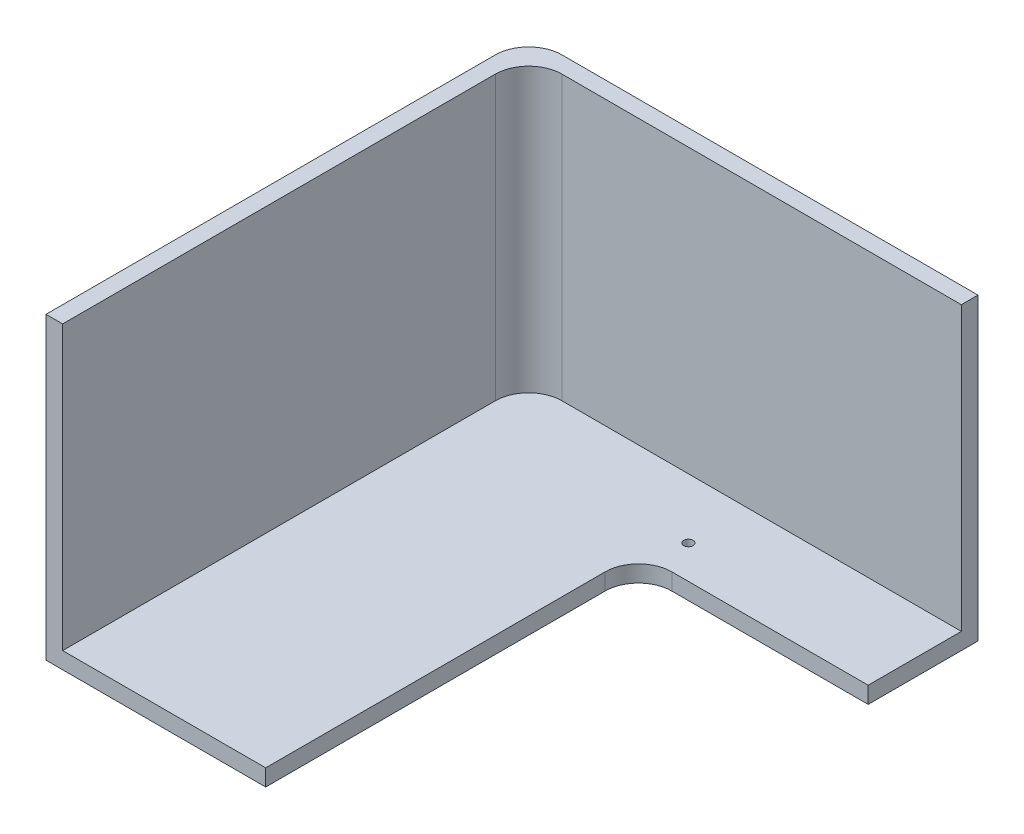
ISO-10303-21;
HEADER;
FILE_DESCRIPTION(('STEP AP214'),'2;1');
FILE_NAME('part.step','',(''),(''),'','','');
FILE_SCHEMA(('AUTOMOTIVE_DESIGN { 1 0 10303 214 1 1 1 1 }'));
ENDSEC;
DATA;
#1=APPLICATION_CONTEXT('core data for automotive mechanical design processes');
#2=APPLICATION_PROTOCOL_DEFINITION('international standard','automotive_design',2000,#1);
#3=PRODUCT_CONTEXT('',#1,'mechanical');
#4=PRODUCT('Part','Part','',(#3));
#5=PRODUCT_RELATED_PRODUCT_CATEGORY('part','',(#4));
#6=PRODUCT_DEFINITION_FORMATION('','',#4);
#7=PRODUCT_DEFINITION_CONTEXT('part definition',#1,'design');
#8=PRODUCT_DEFINITION('design','',#6,#7);
#9=PRODUCT_DEFINITION_SHAPE('','',#8);
#10=(LENGTH_UNIT() NAMED_UNIT(*) SI_UNIT(.MILLI.,.METRE.));
#11=(NAMED_UNIT(*) PLANE_ANGLE_UNIT() SI_UNIT($,.RADIAN.));
#12=(NAMED_UNIT(*) SI_UNIT($,.STERADIAN.) SOLID_ANGLE_UNIT());
#13=UNCERTAINTY_MEASURE_WITH_UNIT(LENGTH_MEASURE(1.E-05),#10,'distance_accuracy_value','');
#14=(GEOMETRIC_REPRESENTATION_CONTEXT(3) GLOBAL_UNCERTAINTY_ASSIGNED_CONTEXT((#13)) GLOBAL_UNIT_ASSIGNED_CONTEXT((#10,
#11,#12)) REPRESENTATION_CONTEXT('',''));
#15=CARTESIAN_POINT('',(0.,0.,0.));
#16=DIRECTION('',(0.,0.,1.));
#17=DIRECTION('',(1.,0.,0.));
#18=AXIS2_PLACEMENT_3D('',#15,#16,#17);
#19=CARTESIAN_POINT('',(0.,90.,0.));
#20=DIRECTION('',(-1.,0.,0.));
#21=DIRECTION('',(0.,0.,1.));
#22=AXIS2_PLACEMENT_3D('',#19,#20,#21);
#23=PLANE('',#22);
#24=DIRECTION('',(0.,0.,-1.));
#25=VECTOR('',#24,1.);
#26=CARTESIAN_POINT('',(0.,5.,5.));
#27=LINE('',#26,#25);
#28=CARTESIAN_POINT('',(0.,5.,33.));
#29=VERTEX_POINT('',#28);
#30=CARTESIAN_POINT('',(0.,5.,5.));
#31=VERTEX_POINT('',#30);
#32=EDGE_CURVE('E170',#29,#31,#27,.T.);
#33=ORIENTED_EDGE('',*,*,#32,.F.);
#34=DIRECTION('',(0.,1.,0.));
#35=VECTOR('',#34,1.);
#36=CARTESIAN_POINT('',(0.,-131.54847015454,33.));
#37=LINE('',#36,#35);
#38=CARTESIAN_POINT('',(0.,0.,33.));
#39=VERTEX_POINT('',#38);
#40=EDGE_CURVE('E163',#39,#29,#37,.T.);
#41=ORIENTED_EDGE('',*,*,#40,.F.);
#42=DIRECTION('',(0.,0.,-1.));
#43=VECTOR('',#42,1.);
#44=CARTESIAN_POINT('',(0.,0.,0.));
#45=LINE('',#44,#43);
#46=CARTESIAN_POINT('',(0.,0.,0.));
#47=VERTEX_POINT('',#46);
#48=EDGE_CURVE('E187',#39,#47,#45,.T.);
#49=ORIENTED_EDGE('',*,*,#48,.T.);
#50=DIRECTION('',(0.,-1.,0.));
#51=VECTOR('',#50,1.);
#52=CARTESIAN_POINT('',(0.,90.,0.));
#53=LINE('',#52,#51);
#54=CARTESIAN_POINT('',(0.,90.,0.));
#55=VERTEX_POINT('',#54);
#56=EDGE_CURVE('E216',#55,#47,#53,.T.);
#57=ORIENTED_EDGE('',*,*,#56,.F.);
#58=DIRECTION('',(0.,0.,-1.));
#59=VECTOR('',#58,1.);
#60=CARTESIAN_POINT('',(0.,90.,0.));
#61=LINE('',#60,#59);
#62=CARTESIAN_POINT('',(0.,90.,5.));
#63=VERTEX_POINT('',#62);
#64=EDGE_CURVE('E188',#63,#55,#61,.T.);
#65=ORIENTED_EDGE('',*,*,#64,.F.);
#66=DIRECTION('',(0.,1.,0.));
#67=VECTOR('',#66,1.);
#68=CARTESIAN_POINT('',(0.,-191.049731745428,5.));
#69=LINE('',#68,#67);
#70=EDGE_CURVE('E176',#31,#63,#69,.T.);
#71=ORIENTED_EDGE('',*,*,#70,.F.);
#72=EDGE_LOOP('',(#33,#41,#49,#57,#65,#71));
#73=FACE_BOUND('',#72,.T.);
#74=ADVANCED_FACE('F49',(#73),#23,.F.);
#75=CARTESIAN_POINT('',(0.,90.,0.));
#76=DIRECTION('',(0.,0.,1.));
#77=DIRECTION('',(1.,0.,0.));
#78=AXIS2_PLACEMENT_3D('',#75,#76,#77);
#79=PLANE('',#78);
#80=DIRECTION('',(-1.,0.,0.));
#81=VECTOR('',#80,1.);
#82=CARTESIAN_POINT('',(0.,0.,0.));
#83=LINE('',#82,#81);
#84=CARTESIAN_POINT('',(-125.,0.,0.));
#85=VERTEX_POINT('',#84);
#86=EDGE_CURVE('E205',#47,#85,#83,.T.);
#87=ORIENTED_EDGE('',*,*,#86,.T.);
#88=DIRECTION('',(0.,-1.,0.));
#89=VECTOR('',#88,1.);
#90=CARTESIAN_POINT('',(-125.,90.,0.));
#91=LINE('',#90,#89);
#92=CARTESIAN_POINT('',(-125.,90.,0.));
#93=VERTEX_POINT('',#92);
#94=EDGE_CURVE('E232',#85,#93,#91,.F.);
#95=ORIENTED_EDGE('',*,*,#94,.T.);
#96=DIRECTION('',(-1.,0.,0.));
#97=VECTOR('',#96,1.);
#98=CARTESIAN_POINT('',(0.,90.,0.));
#99=LINE('',#98,#97);
#100=EDGE_CURVE('E191',#55,#93,#99,.T.);
#101=ORIENTED_EDGE('',*,*,#100,.F.);
#102=ORIENTED_EDGE('',*,*,#56,.T.);
#103=EDGE_LOOP('',(#87,#95,#101,#102));
#104=FACE_BOUND('',#103,.T.);
#105=ADVANCED_FACE('F308',(#104),#79,.F.);
#106=CARTESIAN_POINT('',(-135.,90.,0.));
#107=DIRECTION('',(1.,0.,0.));
#108=DIRECTION('',(0.,0.,-1.));
#109=AXIS2_PLACEMENT_3D('',#106,#107,#108);
#110=PLANE('',#109);
#111=DIRECTION('',(0.,0.,1.));
#112=VECTOR('',#111,1.);
#113=CARTESIAN_POINT('',(-135.,90.,0.));
#114=LINE('',#113,#112);
#115=CARTESIAN_POINT('',(-135.,90.,10.));
#116=VERTEX_POINT('',#115);
#117=CARTESIAN_POINT('',(-135.,90.,145.));
#118=VERTEX_POINT('',#117);
#119=EDGE_CURVE('E195',#116,#118,#114,.T.);
#120=ORIENTED_EDGE('',*,*,#119,.F.);
#121=DIRECTION('',(0.,-1.,0.));
#122=VECTOR('',#121,1.);
#123=CARTESIAN_POINT('',(-135.,90.,10.));
#124=LINE('',#123,#122);
#125=CARTESIAN_POINT('',(-135.,0.,10.));
#126=VERTEX_POINT('',#125);
#127=EDGE_CURVE('E225',#116,#126,#124,.T.);
#128=ORIENTED_EDGE('',*,*,#127,.T.);
#129=DIRECTION('',(0.,0.,1.));
#130=VECTOR('',#129,1.);
#131=CARTESIAN_POINT('',(-135.,0.,0.));
#132=LINE('',#131,#130);
#133=CARTESIAN_POINT('',(-135.,0.,145.));
#134=VERTEX_POINT('',#133);
#135=EDGE_CURVE('E209',#126,#134,#132,.T.);
#136=ORIENTED_EDGE('',*,*,#135,.T.);
#137=DIRECTION('',(0.,-1.,0.));
#138=VECTOR('',#137,1.);
#139=CARTESIAN_POINT('',(-135.,90.,145.));
#140=LINE('',#139,#138);
#141=EDGE_CURVE('E202',#118,#134,#140,.T.);
#142=ORIENTED_EDGE('',*,*,#141,.F.);
#143=EDGE_LOOP('',(#120,#128,#136,#142));
#144=FACE_BOUND('',#143,.T.);
#145=ADVANCED_FACE('F300',(#144),#110,.F.);
#146=CARTESIAN_POINT('',(0.,90.,145.));
#147=DIRECTION('',(0.,0.,-1.));
#148=DIRECTION('',(-1.,0.,0.));
#149=AXIS2_PLACEMENT_3D('',#146,#147,#148);
#150=PLANE('',#149);
#151=DIRECTION('',(1.,0.,0.));
#152=VECTOR('',#151,1.);
#153=CARTESIAN_POINT('',(0.,0.,145.));
#154=LINE('',#153,#152);
#155=CARTESIAN_POINT('',(-69.,0.,145.));
#156=VERTEX_POINT('',#155);
#157=EDGE_CURVE('E161',#134,#156,#154,.T.);
#158=ORIENTED_EDGE('',*,*,#157,.T.);
#159=DIRECTION('',(0.,1.,0.));
#160=VECTOR('',#159,1.);
#161=CARTESIAN_POINT('',(-69.,-131.54847015454,145.));
#162=LINE('',#161,#160);
#163=CARTESIAN_POINT('',(-69.,5.,145.));
#164=VERTEX_POINT('',#163);
#165=EDGE_CURVE('E145',#156,#164,#162,.T.);
#166=ORIENTED_EDGE('',*,*,#165,.T.);
#167=DIRECTION('',(1.,0.,0.));
#168=VECTOR('',#167,1.);
#169=CARTESIAN_POINT('',(0.,5.,145.));
#170=LINE('',#169,#168);
#171=CARTESIAN_POINT('',(-130.,5.,145.));
#172=VERTEX_POINT('',#171);
#173=EDGE_CURVE('E158',#172,#164,#170,.T.);
#174=ORIENTED_EDGE('',*,*,#173,.F.);
#175=DIRECTION('',(0.,1.,0.));
#176=VECTOR('',#175,1.);
#177=CARTESIAN_POINT('',(-130.,-191.049731745428,145.));
#178=LINE('',#177,#176);
#179=CARTESIAN_POINT('',(-130.,90.,145.));
#180=VERTEX_POINT('',#179);
#181=EDGE_CURVE('E171',#172,#180,#178,.T.);
#182=ORIENTED_EDGE('',*,*,#181,.T.);
#183=DIRECTION('',(1.,0.,0.));
#184=VECTOR('',#183,1.);
#185=CARTESIAN_POINT('',(0.,90.,145.));
#186=LINE('',#185,#184);
#187=EDGE_CURVE('E198',#118,#180,#186,.T.);
#188=ORIENTED_EDGE('',*,*,#187,.F.);
#189=ORIENTED_EDGE('',*,*,#141,.T.);
#190=EDGE_LOOP('',(#158,#166,#174,#182,#188,#189));
#191=FACE_BOUND('',#190,.T.);
#192=ADVANCED_FACE('F156',(#191),#150,.F.);
#193=CARTESIAN_POINT('',(0.,90.,0.));
#194=DIRECTION('',(0.,-1.,0.));
#195=DIRECTION('',(0.,0.,-1.));
#196=AXIS2_PLACEMENT_3D('',#193,#194,#195);
#197=PLANE('',#196);
#198=ORIENTED_EDGE('',*,*,#100,.T.);
#199=CARTESIAN_POINT('',(-125.,90.,10.));
#200=DIRECTION('',(0.,-1.,0.));
#201=DIRECTION('',(0.,0.,-1.));
#202=AXIS2_PLACEMENT_3D('',#199,#200,#201);
#203=CIRCLE('',#202,10.);
#204=EDGE_CURVE('E234',#93,#116,#203,.F.);
#205=ORIENTED_EDGE('',*,*,#204,.T.);
#206=ORIENTED_EDGE('',*,*,#119,.T.);
#207=ORIENTED_EDGE('',*,*,#187,.T.);
#208=DIRECTION('',(0.,0.,1.));
#209=VECTOR('',#208,1.);
#210=CARTESIAN_POINT('',(-130.,90.,5.00000000000002));
#211=LINE('',#210,#209);
#212=CARTESIAN_POINT('',(-130.,90.,15.));
#213=VERTEX_POINT('',#212);
#214=EDGE_CURVE('E281',#213,#180,#211,.T.);
#215=ORIENTED_EDGE('',*,*,#214,.F.);
#216=CARTESIAN_POINT('',(-120.,90.,15.));
#217=DIRECTION('',(0.,-1.,0.));
#218=DIRECTION('',(0.,0.,-1.));
#219=AXIS2_PLACEMENT_3D('',#216,#217,#218);
#220=CIRCLE('',#219,10.);
#221=CARTESIAN_POINT('',(-120.,90.,5.00000000000002));
#222=VERTEX_POINT('',#221);
#223=EDGE_CURVE('E12',#213,#222,#220,.T.);
#224=ORIENTED_EDGE('',*,*,#223,.T.);
#225=DIRECTION('',(-1.,0.,0.));
#226=VECTOR('',#225,1.);
#227=CARTESIAN_POINT('',(0.,90.,5.));
#228=LINE('',#227,#226);
#229=EDGE_CURVE('E280',#63,#222,#228,.T.);
#230=ORIENTED_EDGE('',*,*,#229,.F.);
#231=ORIENTED_EDGE('',*,*,#64,.T.);
#232=EDGE_LOOP('',(#198,#205,#206,#207,#215,#224,#230,#231));
#233=FACE_BOUND('',#232,.T.);
#234=ADVANCED_FACE('F293',(#233),#197,.F.);
#235=CARTESIAN_POINT('',(0.,0.,0.));
#236=DIRECTION('',(0.,-1.,0.));
#237=DIRECTION('',(0.,0.,-1.));
#238=AXIS2_PLACEMENT_3D('',#235,#236,#237);
#239=PLANE('',#238);
#240=CARTESIAN_POINT('',(-64.,0.,23.));
#241=DIRECTION('',(0.,-1.,0.));
#242=DIRECTION('',(0.,0.,-1.));
#243=AXIS2_PLACEMENT_3D('',#240,#241,#242);
#244=CIRCLE('',#243,1.4);
#245=CARTESIAN_POINT('',(-64.,0.,21.6));
#246=VERTEX_POINT('',#245);
#247=EDGE_CURVE('E268',#246,#246,#244,.F.);
#248=ORIENTED_EDGE('',*,*,#247,.T.);
#249=EDGE_LOOP('',(#248));
#250=FACE_BOUND('',#249,.T.);
#251=ORIENTED_EDGE('',*,*,#135,.F.);
#252=CARTESIAN_POINT('',(-125.,0.,10.));
#253=DIRECTION('',(0.,-1.,0.));
#254=DIRECTION('',(0.,0.,-1.));
#255=AXIS2_PLACEMENT_3D('',#252,#253,#254);
#256=CIRCLE('',#255,10.);
#257=EDGE_CURVE('E229',#126,#85,#256,.T.);
#258=ORIENTED_EDGE('',*,*,#257,.T.);
#259=ORIENTED_EDGE('',*,*,#86,.F.);
#260=ORIENTED_EDGE('',*,*,#48,.F.);
#261=DIRECTION('',(-1.,0.,0.));
#262=VECTOR('',#261,1.);
#263=CARTESIAN_POINT('',(0.,0.,33.));
#264=LINE('',#263,#262);
#265=CARTESIAN_POINT('',(-59.,0.,33.));
#266=VERTEX_POINT('',#265);
#267=EDGE_CURVE('E151',#39,#266,#264,.T.);
#268=ORIENTED_EDGE('',*,*,#267,.T.);
#269=CARTESIAN_POINT('',(-59.,0.,43.));
#270=DIRECTION('',(0.,-1.,0.));
#271=DIRECTION('',(0.,0.,-1.));
#272=AXIS2_PLACEMENT_3D('',#269,#270,#271);
#273=CIRCLE('',#272,10.);
#274=CARTESIAN_POINT('',(-69.,0.,43.));
#275=VERTEX_POINT('',#274);
#276=EDGE_CURVE('E58',#266,#275,#273,.F.);
#277=ORIENTED_EDGE('',*,*,#276,.T.);
#278=DIRECTION('',(0.,0.,1.));
#279=VECTOR('',#278,1.);
#280=CARTESIAN_POINT('',(-69.,0.,33.));
#281=LINE('',#280,#279);
#282=EDGE_CURVE('E164',#275,#156,#281,.T.);
#283=ORIENTED_EDGE('',*,*,#282,.T.);
#284=ORIENTED_EDGE('',*,*,#157,.F.);
#285=EDGE_LOOP('',(#251,#258,#259,#260,#268,#277,#283,#284));
#286=FACE_BOUND('',#285,.T.);
#287=ADVANCED_FACE('F254',(#250,#286),#239,.T.);
#288=CARTESIAN_POINT('',(0.,5.,0.));
#289=DIRECTION('',(0.,-1.,0.));
#290=DIRECTION('',(0.,0.,-1.));
#291=AXIS2_PLACEMENT_3D('',#288,#289,#290);
#292=PLANE('',#291);
#293=CARTESIAN_POINT('',(-64.,5.,23.));
#294=DIRECTION('',(0.,1.,0.));
#295=DIRECTION('',(0.,0.,1.));
#296=AXIS2_PLACEMENT_3D('',#293,#294,#295);
#297=CIRCLE('',#296,1.4);
#298=CARTESIAN_POINT('',(-64.,5.,24.4));
#299=VERTEX_POINT('',#298);
#300=EDGE_CURVE('E273',#299,#299,#297,.T.);
#301=ORIENTED_EDGE('',*,*,#300,.F.);
#302=EDGE_LOOP('',(#301));
#303=FACE_BOUND('',#302,.T.);
#304=DIRECTION('',(-1.,0.,0.));
#305=VECTOR('',#304,1.);
#306=CARTESIAN_POINT('',(0.,5.,5.));
#307=LINE('',#306,#305);
#308=CARTESIAN_POINT('',(-120.,5.,5.00000000000002));
#309=VERTEX_POINT('',#308);
#310=EDGE_CURVE('E183',#31,#309,#307,.T.);
#311=ORIENTED_EDGE('',*,*,#310,.T.);
#312=CARTESIAN_POINT('',(-120.,5.,15.));
#313=DIRECTION('',(0.,-1.,0.));
#314=DIRECTION('',(0.,0.,-1.));
#315=AXIS2_PLACEMENT_3D('',#312,#313,#314);
#316=CIRCLE('',#315,10.);
#317=CARTESIAN_POINT('',(-130.,5.,15.));
#318=VERTEX_POINT('',#317);
#319=EDGE_CURVE('E72',#309,#318,#316,.F.);
#320=ORIENTED_EDGE('',*,*,#319,.T.);
#321=DIRECTION('',(0.,0.,1.));
#322=VECTOR('',#321,1.);
#323=CARTESIAN_POINT('',(-130.,5.,5.00000000000002));
#324=LINE('',#323,#322);
#325=EDGE_CURVE('E167',#318,#172,#324,.T.);
#326=ORIENTED_EDGE('',*,*,#325,.T.);
#327=ORIENTED_EDGE('',*,*,#173,.T.);
#328=DIRECTION('',(0.,0.,1.));
#329=VECTOR('',#328,1.);
#330=CARTESIAN_POINT('',(-69.,5.,33.));
#331=LINE('',#330,#329);
#332=CARTESIAN_POINT('',(-69.,5.,43.));
#333=VERTEX_POINT('',#332);
#334=EDGE_CURVE('E141',#333,#164,#331,.T.);
#335=ORIENTED_EDGE('',*,*,#334,.F.);
#336=CARTESIAN_POINT('',(-59.,5.,43.));
#337=DIRECTION('',(0.,-1.,0.));
#338=DIRECTION('',(0.,0.,-1.));
#339=AXIS2_PLACEMENT_3D('',#336,#337,#338);
#340=CIRCLE('',#339,10.);
#341=CARTESIAN_POINT('',(-59.,5.,33.));
#342=VERTEX_POINT('',#341);
#343=EDGE_CURVE('E245',#333,#342,#340,.T.);
#344=ORIENTED_EDGE('',*,*,#343,.T.);
#345=DIRECTION('',(-1.,0.,0.));
#346=VECTOR('',#345,1.);
#347=CARTESIAN_POINT('',(0.,5.,33.));
#348=LINE('',#347,#346);
#349=EDGE_CURVE('E152',#29,#342,#348,.T.);
#350=ORIENTED_EDGE('',*,*,#349,.F.);
#351=ORIENTED_EDGE('',*,*,#32,.T.);
#352=EDGE_LOOP('',(#311,#320,#326,#327,#335,#344,#350,#351));
#353=FACE_BOUND('',#352,.T.);
#354=ADVANCED_FACE('F166',(#303,#353),#292,.F.);
#355=CARTESIAN_POINT('',(0.,-191.049731745428,5.));
#356=DIRECTION('',(0.,0.,-1.));
#357=DIRECTION('',(-1.,0.,0.));
#358=AXIS2_PLACEMENT_3D('',#355,#356,#357);
#359=PLANE('',#358);
#360=ORIENTED_EDGE('',*,*,#229,.T.);
#361=DIRECTION('',(0.,1.,0.));
#362=VECTOR('',#361,1.);
#363=CARTESIAN_POINT('',(-120.,5.,5.00000000000002));
#364=LINE('',#363,#362);
#365=EDGE_CURVE('E65',#222,#309,#364,.F.);
#366=ORIENTED_EDGE('',*,*,#365,.T.);
#367=ORIENTED_EDGE('',*,*,#310,.F.);
#368=ORIENTED_EDGE('',*,*,#70,.T.);
#369=EDGE_LOOP('',(#360,#366,#367,#368));
#370=FACE_BOUND('',#369,.T.);
#371=ADVANCED_FACE('F312',(#370),#359,.F.);
#372=CARTESIAN_POINT('',(-130.,-191.049731745428,5.00000000000002));
#373=DIRECTION('',(-1.,0.,0.));
#374=DIRECTION('',(0.,0.,1.));
#375=AXIS2_PLACEMENT_3D('',#372,#373,#374);
#376=PLANE('',#375);
#377=ORIENTED_EDGE('',*,*,#325,.F.);
#378=DIRECTION('',(0.,1.,0.));
#379=VECTOR('',#378,1.);
#380=CARTESIAN_POINT('',(-130.,90.,15.));
#381=LINE('',#380,#379);
#382=EDGE_CURVE('E237',#318,#213,#381,.T.);
#383=ORIENTED_EDGE('',*,*,#382,.T.);
#384=ORIENTED_EDGE('',*,*,#214,.T.);
#385=ORIENTED_EDGE('',*,*,#181,.F.);
#386=EDGE_LOOP('',(#377,#383,#384,#385));
#387=FACE_BOUND('',#386,.T.);
#388=ADVANCED_FACE('F291',(#387),#376,.F.);
#389=CARTESIAN_POINT('',(0.,-131.54847015454,33.));
#390=DIRECTION('',(0.,0.,-1.));
#391=DIRECTION('',(-1.,0.,0.));
#392=AXIS2_PLACEMENT_3D('',#389,#390,#391);
#393=PLANE('',#392);
#394=ORIENTED_EDGE('',*,*,#349,.T.);
#395=DIRECTION('',(0.,1.,0.));
#396=VECTOR('',#395,1.);
#397=CARTESIAN_POINT('',(-59.,0.,33.));
#398=LINE('',#397,#396);
#399=EDGE_CURVE('E222',#342,#266,#398,.F.);
#400=ORIENTED_EDGE('',*,*,#399,.T.);
#401=ORIENTED_EDGE('',*,*,#267,.F.);
#402=ORIENTED_EDGE('',*,*,#40,.T.);
#403=EDGE_LOOP('',(#394,#400,#401,#402));
#404=FACE_BOUND('',#403,.T.);
#405=ADVANCED_FACE('F265',(#404),#393,.F.);
#406=CARTESIAN_POINT('',(-69.,-131.54847015454,33.));
#407=DIRECTION('',(-1.,0.,0.));
#408=DIRECTION('',(0.,0.,1.));
#409=AXIS2_PLACEMENT_3D('',#406,#407,#408);
#410=PLANE('',#409);
#411=ORIENTED_EDGE('',*,*,#282,.F.);
#412=DIRECTION('',(0.,1.,0.));
#413=VECTOR('',#412,1.);
#414=CARTESIAN_POINT('',(-69.,5.,43.));
#415=LINE('',#414,#413);
#416=EDGE_CURVE('E148',#275,#333,#415,.T.);
#417=ORIENTED_EDGE('',*,*,#416,.T.);
#418=ORIENTED_EDGE('',*,*,#334,.T.);
#419=ORIENTED_EDGE('',*,*,#165,.F.);
#420=EDGE_LOOP('',(#411,#417,#418,#419));
#421=FACE_BOUND('',#420,.T.);
#422=ADVANCED_FACE('F144',(#421),#410,.F.);
#423=CARTESIAN_POINT('',(-64.,-3.95979797464467,23.));
#424=DIRECTION('',(0.,1.,0.));
#425=DIRECTION('',(0.,0.,1.));
#426=AXIS2_PLACEMENT_3D('',#423,#424,#425);
#427=CYLINDRICAL_SURFACE('',#426,1.4);
#428=ORIENTED_EDGE('',*,*,#300,.T.);
#429=EDGE_LOOP('',(#428));
#430=FACE_BOUND('',#429,.T.);
#431=ORIENTED_EDGE('',*,*,#247,.F.);
#432=EDGE_LOOP('',(#431));
#433=FACE_BOUND('',#432,.T.);
#434=ADVANCED_FACE('F331',(#430,#433),#427,.F.);
#435=CARTESIAN_POINT('',(-59.,-131.54847015454,43.));
#436=DIRECTION('',(0.,-1.,0.));
#437=DIRECTION('',(0.,0.,-1.));
#438=AXIS2_PLACEMENT_3D('',#435,#436,#437);
#439=CYLINDRICAL_SURFACE('',#438,10.);
#440=ORIENTED_EDGE('',*,*,#276,.F.);
#441=ORIENTED_EDGE('',*,*,#399,.F.);
#442=ORIENTED_EDGE('',*,*,#343,.F.);
#443=ORIENTED_EDGE('',*,*,#416,.F.);
#444=EDGE_LOOP('',(#440,#441,#442,#443));
#445=FACE_BOUND('',#444,.T.);
#446=ADVANCED_FACE('F260',(#445),#439,.F.);
#447=CARTESIAN_POINT('',(-125.,90.,10.));
#448=DIRECTION('',(0.,-1.,0.));
#449=DIRECTION('',(0.,0.,-1.));
#450=AXIS2_PLACEMENT_3D('',#447,#448,#449);
#451=CYLINDRICAL_SURFACE('',#450,10.);
#452=ORIENTED_EDGE('',*,*,#204,.F.);
#453=ORIENTED_EDGE('',*,*,#94,.F.);
#454=ORIENTED_EDGE('',*,*,#257,.F.);
#455=ORIENTED_EDGE('',*,*,#127,.F.);
#456=EDGE_LOOP('',(#452,#453,#454,#455));
#457=FACE_BOUND('',#456,.T.);
#458=ADVANCED_FACE('F304',(#457),#451,.T.);
#459=CARTESIAN_POINT('',(-120.,-191.049731745428,15.));
#460=DIRECTION('',(0.,-1.,0.));
#461=DIRECTION('',(0.,0.,-1.));
#462=AXIS2_PLACEMENT_3D('',#459,#460,#461);
#463=CYLINDRICAL_SURFACE('',#462,10.);
#464=ORIENTED_EDGE('',*,*,#319,.F.);
#465=ORIENTED_EDGE('',*,*,#365,.F.);
#466=ORIENTED_EDGE('',*,*,#223,.F.);
#467=ORIENTED_EDGE('',*,*,#382,.F.);
#468=EDGE_LOOP('',(#464,#465,#466,#467));
#469=FACE_BOUND('',#468,.T.);
#470=ADVANCED_FACE('F51',(#469),#463,.F.);
#471=CLOSED_SHELL('',(#74,#105,#145,#192,#234,#287,#354,#371,#388,#405,#422,#434,#446,#458,#470));
#472=MANIFOLD_SOLID_BREP('B2',#471);
#473=ADVANCED_BREP_SHAPE_REPRESENTATION('',(#18,#472),#14);
#474=SHAPE_DEFINITION_REPRESENTATION(#9,#473);
ENDSEC;
END-ISO-10303-21;
